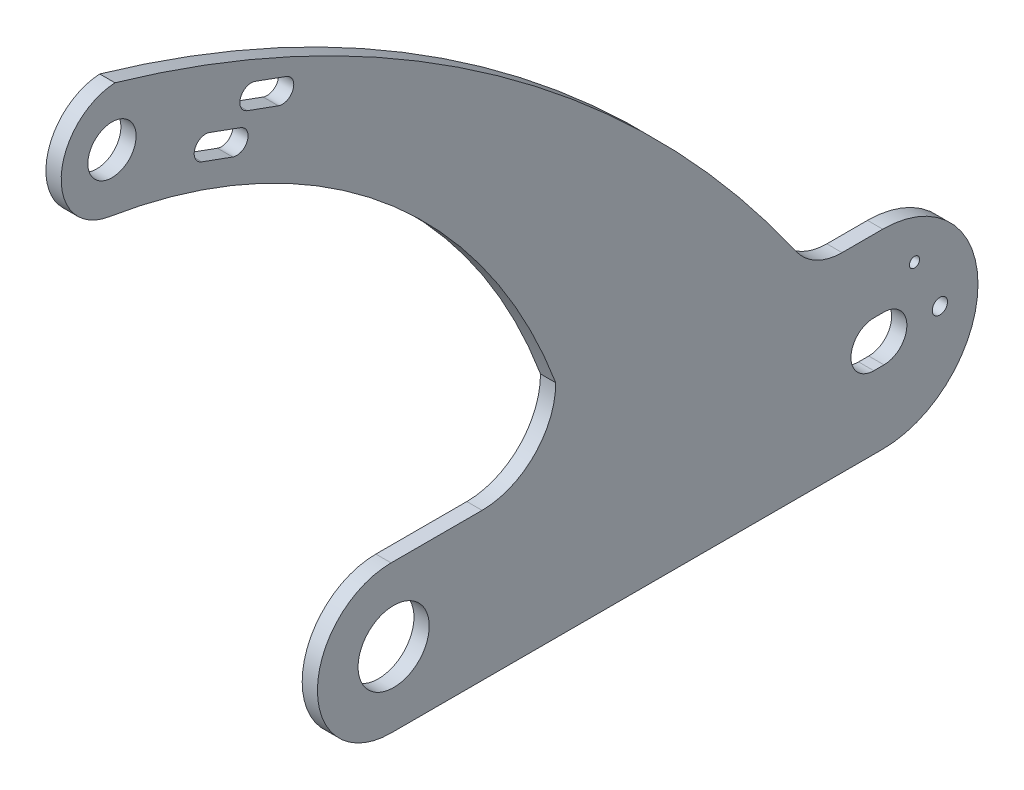
ISO-10303-21;
HEADER;
FILE_DESCRIPTION(('STEP AP214'),'2;1');
FILE_NAME('part.step','',(''),(''),'','','');
FILE_SCHEMA(('AUTOMOTIVE_DESIGN { 1 0 10303 214 1 1 1 1 }'));
ENDSEC;
DATA;
#1=APPLICATION_CONTEXT('core data for automotive mechanical design processes');
#2=APPLICATION_PROTOCOL_DEFINITION('international standard','automotive_design',2000,#1);
#3=PRODUCT_CONTEXT('',#1,'mechanical');
#4=PRODUCT('Part','Part','',(#3));
#5=PRODUCT_RELATED_PRODUCT_CATEGORY('part','',(#4));
#6=PRODUCT_DEFINITION_FORMATION('','',#4);
#7=PRODUCT_DEFINITION_CONTEXT('part definition',#1,'design');
#8=PRODUCT_DEFINITION('design','',#6,#7);
#9=PRODUCT_DEFINITION_SHAPE('','',#8);
#10=(LENGTH_UNIT() NAMED_UNIT(*) SI_UNIT(.MILLI.,.METRE.));
#11=(NAMED_UNIT(*) PLANE_ANGLE_UNIT() SI_UNIT($,.RADIAN.));
#12=(NAMED_UNIT(*) SI_UNIT($,.STERADIAN.) SOLID_ANGLE_UNIT());
#13=UNCERTAINTY_MEASURE_WITH_UNIT(LENGTH_MEASURE(1.E-05),#10,'distance_accuracy_value','');
#14=(GEOMETRIC_REPRESENTATION_CONTEXT(3) GLOBAL_UNCERTAINTY_ASSIGNED_CONTEXT((#13)) GLOBAL_UNIT_ASSIGNED_CONTEXT((#10,
#11,#12)) REPRESENTATION_CONTEXT('',''));
#15=CARTESIAN_POINT('',(0.,0.,0.));
#16=DIRECTION('',(0.,0.,1.));
#17=DIRECTION('',(1.,0.,0.));
#18=AXIS2_PLACEMENT_3D('',#15,#16,#17);
#19=CARTESIAN_POINT('',(3.,14.5,48.375));
#20=DIRECTION('',(-1.,0.,0.));
#21=DIRECTION('',(0.,0.,1.));
#22=AXIS2_PLACEMENT_3D('',#19,#20,#21);
#23=PLANE('',#22);
#24=CARTESIAN_POINT('',(3.,118.095735365004,84.8817253112062));
#25=DIRECTION('',(1.,0.,0.));
#26=DIRECTION('',(0.,0.,-1.));
#27=AXIS2_PLACEMENT_3D('',#24,#25,#26);
#28=CIRCLE('',#27,2.25000000000001);
#29=CARTESIAN_POINT('',(3.,120.210043761772,84.1121799887234));
#30=VERTEX_POINT('',#29);
#31=CARTESIAN_POINT('',(3.,115.981426968236,85.6512706336889));
#32=VERTEX_POINT('',#31);
#33=EDGE_CURVE('E241',#30,#32,#28,.T.);
#34=ORIENTED_EDGE('',*,*,#33,.F.);
#35=DIRECTION('',(0.,0.342020143325678,0.939692620785905));
#36=VECTOR('',#35,1.);
#37=CARTESIAN_POINT('',(3.,120.210043761772,84.1121799887234));
#38=LINE('',#37,#36);
#39=CARTESIAN_POINT('',(3.,117.986912830155,78.0041779536146));
#40=VERTEX_POINT('',#39);
#41=EDGE_CURVE('E252',#40,#30,#38,.T.);
#42=ORIENTED_EDGE('',*,*,#41,.F.);
#43=CARTESIAN_POINT('',(3.,115.872604433387,78.7737232760973));
#44=DIRECTION('',(1.,0.,0.));
#45=DIRECTION('',(0.,0.,-1.));
#46=AXIS2_PLACEMENT_3D('',#43,#44,#45);
#47=CIRCLE('',#46,2.24999999999998);
#48=CARTESIAN_POINT('',(3.,113.758296036619,79.5432685985799));
#49=VERTEX_POINT('',#48);
#50=EDGE_CURVE('E248',#49,#40,#47,.T.);
#51=ORIENTED_EDGE('',*,*,#50,.F.);
#52=DIRECTION('',(0.,-0.342020143325671,-0.939692620785908));
#53=VECTOR('',#52,1.);
#54=CARTESIAN_POINT('',(3.,115.981426968236,85.6512706336889));
#55=LINE('',#54,#53);
#56=EDGE_CURVE('E244',#32,#49,#55,.T.);
#57=ORIENTED_EDGE('',*,*,#56,.F.);
#58=EDGE_LOOP('',(#34,#42,#51,#57));
#59=FACE_BOUND('',#58,.T.);
#60=CARTESIAN_POINT('',(3.,18.75,-59.625));
#61=DIRECTION('',(1.,0.,0.));
#62=DIRECTION('',(0.,0.,-1.));
#63=AXIS2_PLACEMENT_3D('',#60,#61,#62);
#64=CIRCLE('',#63,1.5);
#65=CARTESIAN_POINT('',(3.,18.75,-61.125));
#66=VERTEX_POINT('',#65);
#67=EDGE_CURVE('E351',#66,#66,#64,.T.);
#68=ORIENTED_EDGE('',*,*,#67,.F.);
#69=EDGE_LOOP('',(#68));
#70=FACE_BOUND('',#69,.T.);
#71=CARTESIAN_POINT('',(3.,14.5,48.375));
#72=DIRECTION('',(1.,0.,0.));
#73=DIRECTION('',(0.,0.,1.));
#74=AXIS2_PLACEMENT_3D('',#71,#72,#73);
#75=CIRCLE('',#74,14.5);
#76=CARTESIAN_POINT('',(3.,29.,48.375));
#77=VERTEX_POINT('',#76);
#78=CARTESIAN_POINT('',(3.,0.,48.375));
#79=VERTEX_POINT('',#78);
#80=EDGE_CURVE('E359',#77,#79,#75,.T.);
#81=ORIENTED_EDGE('',*,*,#80,.T.);
#82=DIRECTION('',(0.,0.,-1.));
#83=VECTOR('',#82,1.);
#84=CARTESIAN_POINT('',(3.,0.,48.375));
#85=LINE('',#84,#83);
#86=CARTESIAN_POINT('',(3.,0.,-48.375));
#87=VERTEX_POINT('',#86);
#88=EDGE_CURVE('E363',#79,#87,#85,.T.);
#89=ORIENTED_EDGE('',*,*,#88,.T.);
#90=CARTESIAN_POINT('',(3.,18.75,-48.375));
#91=DIRECTION('',(1.,0.,0.));
#92=DIRECTION('',(0.,0.,1.));
#93=AXIS2_PLACEMENT_3D('',#90,#91,#92);
#94=CIRCLE('',#93,18.75);
#95=CARTESIAN_POINT('',(3.,37.5,-48.375));
#96=VERTEX_POINT('',#95);
#97=EDGE_CURVE('E367',#87,#96,#94,.T.);
#98=ORIENTED_EDGE('',*,*,#97,.T.);
#99=DIRECTION('',(0.,0.,1.));
#100=VECTOR('',#99,1.);
#101=CARTESIAN_POINT('',(3.,37.5,-48.375));
#102=LINE('',#101,#100);
#103=CARTESIAN_POINT('',(3.,37.5,-40.375));
#104=VERTEX_POINT('',#103);
#105=EDGE_CURVE('E370',#96,#104,#102,.T.);
#106=ORIENTED_EDGE('',*,*,#105,.T.);
#107=CARTESIAN_POINT('',(3.,48.5,-40.375));
#108=DIRECTION('',(-1.,0.,0.));
#109=DIRECTION('',(0.,0.,1.));
#110=AXIS2_PLACEMENT_3D('',#107,#108,#109);
#111=CIRCLE('',#110,11.);
#112=CARTESIAN_POINT('',(3.,42.1906592001385,-31.3643275128211));
#113=VERTEX_POINT('',#112);
#114=EDGE_CURVE('E373',#104,#113,#111,.T.);
#115=ORIENTED_EDGE('',*,*,#114,.T.);
#116=CARTESIAN_POINT('',(3.,-99.7246797185502,171.311780890037));
#117=DIRECTION('',(1.,0.,0.));
#118=DIRECTION('',(0.,0.,-1.));
#119=AXIS2_PLACEMENT_3D('',#116,#117,#118);
#120=CIRCLE('',#119,247.42184288727);
#121=CARTESIAN_POINT('',(3.,138.,102.722095146145));
#122=VERTEX_POINT('',#121);
#123=EDGE_CURVE('E376',#113,#122,#120,.T.);
#124=ORIENTED_EDGE('',*,*,#123,.T.);
#125=CARTESIAN_POINT('',(3.,126.801633622701,102.0911827153));
#126=DIRECTION('',(1.,0.,0.));
#127=DIRECTION('',(0.,0.,-1.));
#128=AXIS2_PLACEMENT_3D('',#125,#126,#127);
#129=CIRCLE('',#128,11.216125);
#130=CARTESIAN_POINT('',(3.,115.730561374973,103.889186970363));
#131=VERTEX_POINT('',#130);
#132=EDGE_CURVE('E379',#122,#131,#129,.T.);
#133=ORIENTED_EDGE('',*,*,#132,.T.);
#134=CARTESIAN_POINT('',(3.,4.03485944329796,122.029195711299));
#135=DIRECTION('',(-1.,0.,0.));
#136=DIRECTION('',(0.,0.,1.));
#137=AXIS2_PLACEMENT_3D('',#134,#135,#136);
#138=CIRCLE('',#137,113.159134616393);
#139=CARTESIAN_POINT('',(3.,43.5,15.975));
#140=VERTEX_POINT('',#139);
#141=EDGE_CURVE('E382',#131,#140,#138,.T.);
#142=ORIENTED_EDGE('',*,*,#141,.T.);
#143=CARTESIAN_POINT('',(3.,43.5,30.475));
#144=DIRECTION('',(-1.,0.,0.));
#145=DIRECTION('',(0.,0.,1.));
#146=AXIS2_PLACEMENT_3D('',#143,#144,#145);
#147=CIRCLE('',#146,14.5);
#148=CARTESIAN_POINT('',(3.,29.,30.475));
#149=VERTEX_POINT('',#148);
#150=EDGE_CURVE('E385',#140,#149,#147,.T.);
#151=ORIENTED_EDGE('',*,*,#150,.T.);
#152=DIRECTION('',(0.,0.,1.));
#153=VECTOR('',#152,1.);
#154=CARTESIAN_POINT('',(3.,29.,48.375));
#155=LINE('',#154,#153);
#156=EDGE_CURVE('E388',#149,#77,#155,.T.);
#157=ORIENTED_EDGE('',*,*,#156,.T.);
#158=EDGE_LOOP('',(#81,#89,#98,#106,#115,#124,#133,#142,#151,#157));
#159=FACE_BOUND('',#158,.T.);
#160=CARTESIAN_POINT('',(3.,18.75,-46.625));
#161=DIRECTION('',(1.,0.,0.));
#162=DIRECTION('',(0.,0.,-1.));
#163=AXIS2_PLACEMENT_3D('',#160,#161,#162);
#164=CIRCLE('',#163,4.5);
#165=CARTESIAN_POINT('',(3.,23.25,-46.625));
#166=VERTEX_POINT('',#165);
#167=CARTESIAN_POINT('',(3.,14.25,-46.625));
#168=VERTEX_POINT('',#167);
#169=EDGE_CURVE('E308',#166,#168,#164,.T.);
#170=ORIENTED_EDGE('',*,*,#169,.F.);
#171=DIRECTION('',(0.,0.,1.));
#172=VECTOR('',#171,1.);
#173=CARTESIAN_POINT('',(3.,23.25,-46.625));
#174=LINE('',#173,#172);
#175=CARTESIAN_POINT('',(3.,23.25,-48.625));
#176=VERTEX_POINT('',#175);
#177=EDGE_CURVE('E319',#176,#166,#174,.T.);
#178=ORIENTED_EDGE('',*,*,#177,.F.);
#179=CARTESIAN_POINT('',(3.,18.75,-48.625));
#180=DIRECTION('',(1.,0.,0.));
#181=DIRECTION('',(0.,0.,-1.));
#182=AXIS2_PLACEMENT_3D('',#179,#180,#181);
#183=CIRCLE('',#182,4.5);
#184=CARTESIAN_POINT('',(3.,14.25,-48.625));
#185=VERTEX_POINT('',#184);
#186=EDGE_CURVE('E315',#185,#176,#183,.T.);
#187=ORIENTED_EDGE('',*,*,#186,.F.);
#188=DIRECTION('',(0.,0.,-1.));
#189=VECTOR('',#188,1.);
#190=CARTESIAN_POINT('',(3.,14.25,-46.625));
#191=LINE('',#190,#189);
#192=EDGE_CURVE('E311',#168,#185,#191,.T.);
#193=ORIENTED_EDGE('',*,*,#192,.F.);
#194=EDGE_LOOP('',(#170,#178,#187,#193));
#195=FACE_BOUND('',#194,.T.);
#196=CARTESIAN_POINT('',(3.,28.75,-54.625));
#197=DIRECTION('',(1.,0.,0.));
#198=DIRECTION('',(0.,0.,-1.));
#199=AXIS2_PLACEMENT_3D('',#196,#197,#198);
#200=CIRCLE('',#199,0.999999999999998);
#201=CARTESIAN_POINT('',(3.,28.75,-55.625));
#202=VERTEX_POINT('',#201);
#203=EDGE_CURVE('E300',#202,#202,#200,.T.);
#204=ORIENTED_EDGE('',*,*,#203,.F.);
#205=EDGE_LOOP('',(#204));
#206=FACE_BOUND('',#205,.T.);
#207=CARTESIAN_POINT('',(3.,14.5,47.875));
#208=DIRECTION('',(1.,0.,0.));
#209=DIRECTION('',(0.,0.,-1.));
#210=AXIS2_PLACEMENT_3D('',#207,#208,#209);
#211=CIRCLE('',#210,7.);
#212=CARTESIAN_POINT('',(3.,14.5,40.875));
#213=VERTEX_POINT('',#212);
#214=EDGE_CURVE('E292',#213,#213,#211,.T.);
#215=ORIENTED_EDGE('',*,*,#214,.F.);
#216=EDGE_LOOP('',(#215));
#217=FACE_BOUND('',#216,.T.);
#218=CARTESIAN_POINT('',(3.,126.865280687486,103.305641058254));
#219=DIRECTION('',(1.,0.,0.));
#220=DIRECTION('',(0.,0.,-1.));
#221=AXIS2_PLACEMENT_3D('',#218,#219,#220);
#222=CIRCLE('',#221,4.75000000000001);
#223=CARTESIAN_POINT('',(3.,126.865280687486,98.5556410582536));
#224=VERTEX_POINT('',#223);
#225=EDGE_CURVE('E284',#224,#224,#222,.T.);
#226=ORIENTED_EDGE('',*,*,#225,.F.);
#227=EDGE_LOOP('',(#226));
#228=FACE_BOUND('',#227,.T.);
#229=CARTESIAN_POINT('',(3.,122.32435215854,75.8898695568463));
#230=DIRECTION('',(1.,0.,0.));
#231=DIRECTION('',(0.,0.,-1.));
#232=AXIS2_PLACEMENT_3D('',#229,#230,#231);
#233=CIRCLE('',#232,2.24999999999995);
#234=CARTESIAN_POINT('',(3.,124.438660555309,75.1203242343635));
#235=VERTEX_POINT('',#234);
#236=CARTESIAN_POINT('',(3.,120.210043761772,76.6594148793291));
#237=VERTEX_POINT('',#236);
#238=EDGE_CURVE('E193',#235,#237,#233,.T.);
#239=ORIENTED_EDGE('',*,*,#238,.F.);
#240=DIRECTION('',(0.,0.34202014332567,0.939692620785908));
#241=VECTOR('',#240,1.);
#242=CARTESIAN_POINT('',(3.,124.438660555309,75.1203242343635));
#243=LINE('',#242,#241);
#244=CARTESIAN_POINT('',(3.,122.215529623692,69.0123221992552));
#245=VERTEX_POINT('',#244);
#246=EDGE_CURVE('E219',#245,#235,#243,.T.);
#247=ORIENTED_EDGE('',*,*,#246,.F.);
#248=CARTESIAN_POINT('',(3.,120.101221226923,69.7818675217379));
#249=DIRECTION('',(1.,0.,0.));
#250=DIRECTION('',(0.,0.,-1.));
#251=AXIS2_PLACEMENT_3D('',#248,#249,#250);
#252=CIRCLE('',#251,2.24999999999998);
#253=CARTESIAN_POINT('',(3.,117.986912830155,70.5514128442207));
#254=VERTEX_POINT('',#253);
#255=EDGE_CURVE('E215',#254,#245,#252,.T.);
#256=ORIENTED_EDGE('',*,*,#255,.F.);
#257=DIRECTION('',(0.,-0.342020143325676,-0.939692620785906));
#258=VECTOR('',#257,1.);
#259=CARTESIAN_POINT('',(3.,120.210043761772,76.6594148793291));
#260=LINE('',#259,#258);
#261=EDGE_CURVE('E202',#237,#254,#260,.T.);
#262=ORIENTED_EDGE('',*,*,#261,.F.);
#263=EDGE_LOOP('',(#239,#247,#256,#262));
#264=FACE_BOUND('',#263,.T.);
#265=ADVANCED_FACE('F43',(#59,#70,#159,#195,#206,#217,#228,#264),#23,.F.);
#266=CARTESIAN_POINT('',(0.,14.5,48.375));
#267=DIRECTION('',(-1.,0.,0.));
#268=DIRECTION('',(0.,0.,1.));
#269=AXIS2_PLACEMENT_3D('',#266,#267,#268);
#270=PLANE('',#269);
#271=CARTESIAN_POINT('',(0.,14.5,47.875));
#272=DIRECTION('',(1.,0.,0.));
#273=DIRECTION('',(0.,0.,-1.));
#274=AXIS2_PLACEMENT_3D('',#271,#272,#273);
#275=CIRCLE('',#274,7.);
#276=CARTESIAN_POINT('',(0.,14.5,40.875));
#277=VERTEX_POINT('',#276);
#278=EDGE_CURVE('E288',#277,#277,#275,.T.);
#279=ORIENTED_EDGE('',*,*,#278,.T.);
#280=EDGE_LOOP('',(#279));
#281=FACE_BOUND('',#280,.T.);
#282=DIRECTION('',(0.,0.,1.));
#283=VECTOR('',#282,1.);
#284=CARTESIAN_POINT('',(0.,23.25,-46.625));
#285=LINE('',#284,#283);
#286=CARTESIAN_POINT('',(0.,23.25,-48.625));
#287=VERTEX_POINT('',#286);
#288=CARTESIAN_POINT('',(0.,23.25,-46.625));
#289=VERTEX_POINT('',#288);
#290=EDGE_CURVE('E312',#287,#289,#285,.T.);
#291=ORIENTED_EDGE('',*,*,#290,.T.);
#292=CARTESIAN_POINT('',(0.,18.75,-46.625));
#293=DIRECTION('',(1.,0.,0.));
#294=DIRECTION('',(0.,0.,-1.));
#295=AXIS2_PLACEMENT_3D('',#292,#293,#294);
#296=CIRCLE('',#295,4.5);
#297=CARTESIAN_POINT('',(0.,14.25,-46.625));
#298=VERTEX_POINT('',#297);
#299=EDGE_CURVE('E304',#289,#298,#296,.T.);
#300=ORIENTED_EDGE('',*,*,#299,.T.);
#301=DIRECTION('',(0.,0.,-1.));
#302=VECTOR('',#301,1.);
#303=CARTESIAN_POINT('',(0.,14.25,-46.625));
#304=LINE('',#303,#302);
#305=CARTESIAN_POINT('',(0.,14.25,-48.625));
#306=VERTEX_POINT('',#305);
#307=EDGE_CURVE('E326',#298,#306,#304,.T.);
#308=ORIENTED_EDGE('',*,*,#307,.T.);
#309=CARTESIAN_POINT('',(0.,18.75,-48.625));
#310=DIRECTION('',(1.,0.,0.));
#311=DIRECTION('',(0.,0.,-1.));
#312=AXIS2_PLACEMENT_3D('',#309,#310,#311);
#313=CIRCLE('',#312,4.5);
#314=EDGE_CURVE('E330',#306,#287,#313,.T.);
#315=ORIENTED_EDGE('',*,*,#314,.T.);
#316=EDGE_LOOP('',(#291,#300,#308,#315));
#317=FACE_BOUND('',#316,.T.);
#318=CARTESIAN_POINT('',(0.,18.75,-59.625));
#319=DIRECTION('',(1.,0.,0.));
#320=DIRECTION('',(0.,0.,-1.));
#321=AXIS2_PLACEMENT_3D('',#318,#319,#320);
#322=CIRCLE('',#321,1.5);
#323=CARTESIAN_POINT('',(0.,18.75,-61.125));
#324=VERTEX_POINT('',#323);
#325=EDGE_CURVE('E350',#324,#324,#322,.T.);
#326=ORIENTED_EDGE('',*,*,#325,.T.);
#327=EDGE_LOOP('',(#326));
#328=FACE_BOUND('',#327,.T.);
#329=CARTESIAN_POINT('',(0.,14.5,48.375));
#330=DIRECTION('',(1.,0.,0.));
#331=DIRECTION('',(0.,0.,1.));
#332=AXIS2_PLACEMENT_3D('',#329,#330,#331);
#333=CIRCLE('',#332,14.5);
#334=CARTESIAN_POINT('',(0.,29.,48.375));
#335=VERTEX_POINT('',#334);
#336=CARTESIAN_POINT('',(0.,0.,48.375));
#337=VERTEX_POINT('',#336);
#338=EDGE_CURVE('E355',#335,#337,#333,.T.);
#339=ORIENTED_EDGE('',*,*,#338,.F.);
#340=DIRECTION('',(0.,0.,1.));
#341=VECTOR('',#340,1.);
#342=CARTESIAN_POINT('',(0.,29.,48.375));
#343=LINE('',#342,#341);
#344=CARTESIAN_POINT('',(0.,29.,30.475));
#345=VERTEX_POINT('',#344);
#346=EDGE_CURVE('E364',#345,#335,#343,.T.);
#347=ORIENTED_EDGE('',*,*,#346,.F.);
#348=CARTESIAN_POINT('',(0.,43.5,30.475));
#349=DIRECTION('',(-1.,0.,0.));
#350=DIRECTION('',(0.,0.,1.));
#351=AXIS2_PLACEMENT_3D('',#348,#349,#350);
#352=CIRCLE('',#351,14.5);
#353=CARTESIAN_POINT('',(0.,43.5,15.975));
#354=VERTEX_POINT('',#353);
#355=EDGE_CURVE('E416',#354,#345,#352,.T.);
#356=ORIENTED_EDGE('',*,*,#355,.F.);
#357=CARTESIAN_POINT('',(0.,4.03485944329796,122.029195711299));
#358=DIRECTION('',(-1.,0.,0.));
#359=DIRECTION('',(0.,0.,1.));
#360=AXIS2_PLACEMENT_3D('',#357,#358,#359);
#361=CIRCLE('',#360,113.159134616393);
#362=CARTESIAN_POINT('',(0.,115.730561374973,103.889186970363));
#363=VERTEX_POINT('',#362);
#364=EDGE_CURVE('E413',#363,#354,#361,.T.);
#365=ORIENTED_EDGE('',*,*,#364,.F.);
#366=CARTESIAN_POINT('',(0.,126.801633622701,102.0911827153));
#367=DIRECTION('',(1.,0.,0.));
#368=DIRECTION('',(0.,0.,-1.));
#369=AXIS2_PLACEMENT_3D('',#366,#367,#368);
#370=CIRCLE('',#369,11.216125);
#371=CARTESIAN_POINT('',(0.,138.,102.722095146145));
#372=VERTEX_POINT('',#371);
#373=EDGE_CURVE('E410',#372,#363,#370,.T.);
#374=ORIENTED_EDGE('',*,*,#373,.F.);
#375=CARTESIAN_POINT('',(0.,-99.7246797185502,171.311780890037));
#376=DIRECTION('',(1.,0.,0.));
#377=DIRECTION('',(0.,0.,-1.));
#378=AXIS2_PLACEMENT_3D('',#375,#376,#377);
#379=CIRCLE('',#378,247.42184288727);
#380=CARTESIAN_POINT('',(0.,42.1906592001385,-31.3643275128211));
#381=VERTEX_POINT('',#380);
#382=EDGE_CURVE('E407',#381,#372,#379,.T.);
#383=ORIENTED_EDGE('',*,*,#382,.F.);
#384=CARTESIAN_POINT('',(0.,48.5,-40.375));
#385=DIRECTION('',(-1.,0.,0.));
#386=DIRECTION('',(0.,0.,1.));
#387=AXIS2_PLACEMENT_3D('',#384,#385,#386);
#388=CIRCLE('',#387,11.);
#389=CARTESIAN_POINT('',(0.,37.5,-40.375));
#390=VERTEX_POINT('',#389);
#391=EDGE_CURVE('E404',#390,#381,#388,.T.);
#392=ORIENTED_EDGE('',*,*,#391,.F.);
#393=DIRECTION('',(0.,0.,1.));
#394=VECTOR('',#393,1.);
#395=CARTESIAN_POINT('',(0.,37.5,-48.375));
#396=LINE('',#395,#394);
#397=CARTESIAN_POINT('',(0.,37.5,-48.375));
#398=VERTEX_POINT('',#397);
#399=EDGE_CURVE('E401',#398,#390,#396,.T.);
#400=ORIENTED_EDGE('',*,*,#399,.F.);
#401=CARTESIAN_POINT('',(0.,18.75,-48.375));
#402=DIRECTION('',(1.,0.,0.));
#403=DIRECTION('',(0.,0.,1.));
#404=AXIS2_PLACEMENT_3D('',#401,#402,#403);
#405=CIRCLE('',#404,18.75);
#406=CARTESIAN_POINT('',(0.,0.,-48.375));
#407=VERTEX_POINT('',#406);
#408=EDGE_CURVE('E398',#407,#398,#405,.T.);
#409=ORIENTED_EDGE('',*,*,#408,.F.);
#410=DIRECTION('',(0.,0.,-1.));
#411=VECTOR('',#410,1.);
#412=CARTESIAN_POINT('',(0.,0.,48.375));
#413=LINE('',#412,#411);
#414=EDGE_CURVE('E395',#337,#407,#413,.T.);
#415=ORIENTED_EDGE('',*,*,#414,.F.);
#416=EDGE_LOOP('',(#339,#347,#356,#365,#374,#383,#392,#400,#409,#415));
#417=FACE_BOUND('',#416,.T.);
#418=CARTESIAN_POINT('',(0.,28.75,-54.625));
#419=DIRECTION('',(1.,0.,0.));
#420=DIRECTION('',(0.,0.,-1.));
#421=AXIS2_PLACEMENT_3D('',#418,#419,#420);
#422=CIRCLE('',#421,0.999999999999998);
#423=CARTESIAN_POINT('',(0.,28.75,-55.625));
#424=VERTEX_POINT('',#423);
#425=EDGE_CURVE('E296',#424,#424,#422,.T.);
#426=ORIENTED_EDGE('',*,*,#425,.T.);
#427=EDGE_LOOP('',(#426));
#428=FACE_BOUND('',#427,.T.);
#429=CARTESIAN_POINT('',(0.,126.865280687486,103.305641058254));
#430=DIRECTION('',(1.,0.,0.));
#431=DIRECTION('',(0.,0.,-1.));
#432=AXIS2_PLACEMENT_3D('',#429,#430,#431);
#433=CIRCLE('',#432,4.75000000000001);
#434=CARTESIAN_POINT('',(0.,126.865280687486,98.5556410582536));
#435=VERTEX_POINT('',#434);
#436=EDGE_CURVE('E283',#435,#435,#433,.T.);
#437=ORIENTED_EDGE('',*,*,#436,.T.);
#438=EDGE_LOOP('',(#437));
#439=FACE_BOUND('',#438,.T.);
#440=DIRECTION('',(0.,0.342020143325678,0.939692620785905));
#441=VECTOR('',#440,1.);
#442=CARTESIAN_POINT('',(0.,120.210043761772,84.1121799887234));
#443=LINE('',#442,#441);
#444=CARTESIAN_POINT('',(0.,117.986912830155,78.0041779536146));
#445=VERTEX_POINT('',#444);
#446=CARTESIAN_POINT('',(0.,120.210043761772,84.1121799887234));
#447=VERTEX_POINT('',#446);
#448=EDGE_CURVE('E245',#445,#447,#443,.T.);
#449=ORIENTED_EDGE('',*,*,#448,.T.);
#450=CARTESIAN_POINT('',(0.,118.095735365004,84.8817253112062));
#451=DIRECTION('',(1.,0.,0.));
#452=DIRECTION('',(0.,0.,-1.));
#453=AXIS2_PLACEMENT_3D('',#450,#451,#452);
#454=CIRCLE('',#453,2.25000000000001);
#455=CARTESIAN_POINT('',(0.,115.981426968236,85.6512706336889));
#456=VERTEX_POINT('',#455);
#457=EDGE_CURVE('E211',#447,#456,#454,.T.);
#458=ORIENTED_EDGE('',*,*,#457,.T.);
#459=DIRECTION('',(0.,-0.342020143325671,-0.939692620785908));
#460=VECTOR('',#459,1.);
#461=CARTESIAN_POINT('',(0.,115.981426968236,85.6512706336889));
#462=LINE('',#461,#460);
#463=CARTESIAN_POINT('',(0.,113.758296036619,79.5432685985799));
#464=VERTEX_POINT('',#463);
#465=EDGE_CURVE('E259',#456,#464,#462,.T.);
#466=ORIENTED_EDGE('',*,*,#465,.T.);
#467=CARTESIAN_POINT('',(0.,115.872604433387,78.7737232760973));
#468=DIRECTION('',(1.,0.,0.));
#469=DIRECTION('',(0.,0.,-1.));
#470=AXIS2_PLACEMENT_3D('',#467,#468,#469);
#471=CIRCLE('',#470,2.24999999999998);
#472=EDGE_CURVE('E263',#464,#445,#471,.T.);
#473=ORIENTED_EDGE('',*,*,#472,.T.);
#474=EDGE_LOOP('',(#449,#458,#466,#473));
#475=FACE_BOUND('',#474,.T.);
#476=DIRECTION('',(0.,0.34202014332567,0.939692620785908));
#477=VECTOR('',#476,1.);
#478=CARTESIAN_POINT('',(0.,124.438660555309,75.1203242343635));
#479=LINE('',#478,#477);
#480=CARTESIAN_POINT('',(0.,122.215529623692,69.0123221992552));
#481=VERTEX_POINT('',#480);
#482=CARTESIAN_POINT('',(0.,124.438660555309,75.1203242343635));
#483=VERTEX_POINT('',#482);
#484=EDGE_CURVE('E203',#481,#483,#479,.T.);
#485=ORIENTED_EDGE('',*,*,#484,.T.);
#486=CARTESIAN_POINT('',(0.,122.32435215854,75.8898695568463));
#487=DIRECTION('',(1.,0.,0.));
#488=DIRECTION('',(0.,0.,-1.));
#489=AXIS2_PLACEMENT_3D('',#486,#487,#488);
#490=CIRCLE('',#489,2.24999999999995);
#491=CARTESIAN_POINT('',(0.,120.210043761772,76.6594148793291));
#492=VERTEX_POINT('',#491);
#493=EDGE_CURVE('E67',#483,#492,#490,.T.);
#494=ORIENTED_EDGE('',*,*,#493,.T.);
#495=DIRECTION('',(0.,-0.342020143325676,-0.939692620785906));
#496=VECTOR('',#495,1.);
#497=CARTESIAN_POINT('',(0.,120.210043761772,76.6594148793291));
#498=LINE('',#497,#496);
#499=CARTESIAN_POINT('',(0.,117.986912830155,70.5514128442207));
#500=VERTEX_POINT('',#499);
#501=EDGE_CURVE('E209',#492,#500,#498,.T.);
#502=ORIENTED_EDGE('',*,*,#501,.T.);
#503=CARTESIAN_POINT('',(0.,120.101221226923,69.7818675217379));
#504=DIRECTION('',(1.,0.,0.));
#505=DIRECTION('',(0.,0.,-1.));
#506=AXIS2_PLACEMENT_3D('',#503,#504,#505);
#507=CIRCLE('',#506,2.24999999999998);
#508=EDGE_CURVE('E228',#500,#481,#507,.T.);
#509=ORIENTED_EDGE('',*,*,#508,.T.);
#510=EDGE_LOOP('',(#485,#494,#502,#509));
#511=FACE_BOUND('',#510,.T.);
#512=ADVANCED_FACE('F463',(#281,#317,#328,#417,#428,#439,#475,#511),#270,.T.);
#513=CARTESIAN_POINT('',(3.,14.5,48.375));
#514=DIRECTION('',(-1.,0.,0.));
#515=DIRECTION('',(0.,0.,1.));
#516=AXIS2_PLACEMENT_3D('',#513,#514,#515);
#517=CYLINDRICAL_SURFACE('',#516,14.5);
#518=ORIENTED_EDGE('',*,*,#338,.T.);
#519=DIRECTION('',(-1.,0.,0.));
#520=VECTOR('',#519,1.);
#521=CARTESIAN_POINT('',(3.,0.,48.375));
#522=LINE('',#521,#520);
#523=EDGE_CURVE('E11',#79,#337,#522,.T.);
#524=ORIENTED_EDGE('',*,*,#523,.F.);
#525=ORIENTED_EDGE('',*,*,#80,.F.);
#526=DIRECTION('',(-1.,0.,0.));
#527=VECTOR('',#526,1.);
#528=CARTESIAN_POINT('',(3.,29.,48.375));
#529=LINE('',#528,#527);
#530=EDGE_CURVE('E391',#77,#335,#529,.T.);
#531=ORIENTED_EDGE('',*,*,#530,.T.);
#532=EDGE_LOOP('',(#518,#524,#525,#531));
#533=FACE_BOUND('',#532,.T.);
#534=ADVANCED_FACE('F45',(#533),#517,.T.);
#535=CARTESIAN_POINT('',(3.,0.,48.375));
#536=DIRECTION('',(0.,1.,0.));
#537=DIRECTION('',(0.,0.,1.));
#538=AXIS2_PLACEMENT_3D('',#535,#536,#537);
#539=PLANE('',#538);
#540=ORIENTED_EDGE('',*,*,#414,.T.);
#541=DIRECTION('',(-1.,0.,0.));
#542=VECTOR('',#541,1.);
#543=CARTESIAN_POINT('',(3.,0.,-48.375));
#544=LINE('',#543,#542);
#545=EDGE_CURVE('E52',#87,#407,#544,.T.);
#546=ORIENTED_EDGE('',*,*,#545,.F.);
#547=ORIENTED_EDGE('',*,*,#88,.F.);
#548=ORIENTED_EDGE('',*,*,#523,.T.);
#549=EDGE_LOOP('',(#540,#546,#547,#548));
#550=FACE_BOUND('',#549,.T.);
#551=ADVANCED_FACE('F481',(#550),#539,.F.);
#552=CARTESIAN_POINT('',(3.,18.75,-48.375));
#553=DIRECTION('',(-1.,0.,0.));
#554=DIRECTION('',(0.,0.,1.));
#555=AXIS2_PLACEMENT_3D('',#552,#553,#554);
#556=CYLINDRICAL_SURFACE('',#555,18.75);
#557=ORIENTED_EDGE('',*,*,#408,.T.);
#558=DIRECTION('',(-1.,0.,0.));
#559=VECTOR('',#558,1.);
#560=CARTESIAN_POINT('',(3.,37.5,-48.375));
#561=LINE('',#560,#559);
#562=EDGE_CURVE('E448',#96,#398,#561,.T.);
#563=ORIENTED_EDGE('',*,*,#562,.F.);
#564=ORIENTED_EDGE('',*,*,#97,.F.);
#565=ORIENTED_EDGE('',*,*,#545,.T.);
#566=EDGE_LOOP('',(#557,#563,#564,#565));
#567=FACE_BOUND('',#566,.T.);
#568=ADVANCED_FACE('F457',(#567),#556,.T.);
#569=CARTESIAN_POINT('',(3.,37.5,-48.375));
#570=DIRECTION('',(0.,-1.,0.));
#571=DIRECTION('',(0.,0.,-1.));
#572=AXIS2_PLACEMENT_3D('',#569,#570,#571);
#573=PLANE('',#572);
#574=ORIENTED_EDGE('',*,*,#399,.T.);
#575=DIRECTION('',(-1.,0.,0.));
#576=VECTOR('',#575,1.);
#577=CARTESIAN_POINT('',(3.,37.5,-40.375));
#578=LINE('',#577,#576);
#579=EDGE_CURVE('E444',#104,#390,#578,.T.);
#580=ORIENTED_EDGE('',*,*,#579,.F.);
#581=ORIENTED_EDGE('',*,*,#105,.F.);
#582=ORIENTED_EDGE('',*,*,#562,.T.);
#583=EDGE_LOOP('',(#574,#580,#581,#582));
#584=FACE_BOUND('',#583,.T.);
#585=ADVANCED_FACE('F469',(#584),#573,.F.);
#586=CARTESIAN_POINT('',(3.,48.5,-40.375));
#587=DIRECTION('',(-1.,0.,0.));
#588=DIRECTION('',(0.,0.,1.));
#589=AXIS2_PLACEMENT_3D('',#586,#587,#588);
#590=CYLINDRICAL_SURFACE('',#589,11.);
#591=ORIENTED_EDGE('',*,*,#391,.T.);
#592=DIRECTION('',(-1.,0.,0.));
#593=VECTOR('',#592,1.);
#594=CARTESIAN_POINT('',(3.,42.1906592001385,-31.3643275128211));
#595=LINE('',#594,#593);
#596=EDGE_CURVE('E440',#113,#381,#595,.T.);
#597=ORIENTED_EDGE('',*,*,#596,.F.);
#598=ORIENTED_EDGE('',*,*,#114,.F.);
#599=ORIENTED_EDGE('',*,*,#579,.T.);
#600=EDGE_LOOP('',(#591,#597,#598,#599));
#601=FACE_BOUND('',#600,.T.);
#602=ADVANCED_FACE('F473',(#601),#590,.F.);
#603=CARTESIAN_POINT('',(3.,-99.7246797185502,171.311780890037));
#604=DIRECTION('',(-1.,0.,0.));
#605=DIRECTION('',(0.,0.,1.));
#606=AXIS2_PLACEMENT_3D('',#603,#604,#605);
#607=CYLINDRICAL_SURFACE('',#606,247.42184288727);
#608=ORIENTED_EDGE('',*,*,#382,.T.);
#609=DIRECTION('',(-1.,0.,0.));
#610=VECTOR('',#609,1.);
#611=CARTESIAN_POINT('',(3.,138.,102.722095146145));
#612=LINE('',#611,#610);
#613=EDGE_CURVE('E436',#122,#372,#612,.T.);
#614=ORIENTED_EDGE('',*,*,#613,.F.);
#615=ORIENTED_EDGE('',*,*,#123,.F.);
#616=ORIENTED_EDGE('',*,*,#596,.T.);
#617=EDGE_LOOP('',(#608,#614,#615,#616));
#618=FACE_BOUND('',#617,.T.);
#619=ADVANCED_FACE('F504',(#618),#607,.T.);
#620=CARTESIAN_POINT('',(3.,126.801633622701,102.0911827153));
#621=DIRECTION('',(-1.,0.,0.));
#622=DIRECTION('',(0.,0.,1.));
#623=AXIS2_PLACEMENT_3D('',#620,#621,#622);
#624=CYLINDRICAL_SURFACE('',#623,11.216125);
#625=ORIENTED_EDGE('',*,*,#373,.T.);
#626=DIRECTION('',(-1.,0.,0.));
#627=VECTOR('',#626,1.);
#628=CARTESIAN_POINT('',(3.,115.730561374973,103.889186970363));
#629=LINE('',#628,#627);
#630=EDGE_CURVE('E432',#131,#363,#629,.T.);
#631=ORIENTED_EDGE('',*,*,#630,.F.);
#632=ORIENTED_EDGE('',*,*,#132,.F.);
#633=ORIENTED_EDGE('',*,*,#613,.T.);
#634=EDGE_LOOP('',(#625,#631,#632,#633));
#635=FACE_BOUND('',#634,.T.);
#636=ADVANCED_FACE('F501',(#635),#624,.T.);
#637=CARTESIAN_POINT('',(3.,4.03485944329796,122.029195711299));
#638=DIRECTION('',(-1.,0.,0.));
#639=DIRECTION('',(0.,0.,1.));
#640=AXIS2_PLACEMENT_3D('',#637,#638,#639);
#641=CYLINDRICAL_SURFACE('',#640,113.159134616393);
#642=ORIENTED_EDGE('',*,*,#364,.T.);
#643=DIRECTION('',(-1.,0.,0.));
#644=VECTOR('',#643,1.);
#645=CARTESIAN_POINT('',(3.,43.5,15.975));
#646=LINE('',#645,#644);
#647=EDGE_CURVE('E428',#140,#354,#646,.T.);
#648=ORIENTED_EDGE('',*,*,#647,.F.);
#649=ORIENTED_EDGE('',*,*,#141,.F.);
#650=ORIENTED_EDGE('',*,*,#630,.T.);
#651=EDGE_LOOP('',(#642,#648,#649,#650));
#652=FACE_BOUND('',#651,.T.);
#653=ADVANCED_FACE('F497',(#652),#641,.F.);
#654=CARTESIAN_POINT('',(3.,43.5,30.475));
#655=DIRECTION('',(-1.,0.,0.));
#656=DIRECTION('',(0.,0.,1.));
#657=AXIS2_PLACEMENT_3D('',#654,#655,#656);
#658=CYLINDRICAL_SURFACE('',#657,14.5);
#659=ORIENTED_EDGE('',*,*,#355,.T.);
#660=DIRECTION('',(-1.,0.,0.));
#661=VECTOR('',#660,1.);
#662=CARTESIAN_POINT('',(3.,29.,30.475));
#663=LINE('',#662,#661);
#664=EDGE_CURVE('E424',#149,#345,#663,.T.);
#665=ORIENTED_EDGE('',*,*,#664,.F.);
#666=ORIENTED_EDGE('',*,*,#150,.F.);
#667=ORIENTED_EDGE('',*,*,#647,.T.);
#668=EDGE_LOOP('',(#659,#665,#666,#667));
#669=FACE_BOUND('',#668,.T.);
#670=ADVANCED_FACE('F493',(#669),#658,.F.);
#671=CARTESIAN_POINT('',(3.,29.,48.375));
#672=DIRECTION('',(0.,-1.,0.));
#673=DIRECTION('',(0.,0.,-1.));
#674=AXIS2_PLACEMENT_3D('',#671,#672,#673);
#675=PLANE('',#674);
#676=ORIENTED_EDGE('',*,*,#346,.T.);
#677=ORIENTED_EDGE('',*,*,#530,.F.);
#678=ORIENTED_EDGE('',*,*,#156,.F.);
#679=ORIENTED_EDGE('',*,*,#664,.T.);
#680=EDGE_LOOP('',(#676,#677,#678,#679));
#681=FACE_BOUND('',#680,.T.);
#682=ADVANCED_FACE('F488',(#681),#675,.F.);
#683=CARTESIAN_POINT('',(3.,18.75,-59.625));
#684=DIRECTION('',(-1.,0.,0.));
#685=DIRECTION('',(0.,0.,1.));
#686=AXIS2_PLACEMENT_3D('',#683,#684,#685);
#687=CYLINDRICAL_SURFACE('',#686,1.5);
#688=ORIENTED_EDGE('',*,*,#67,.T.);
#689=EDGE_LOOP('',(#688));
#690=FACE_BOUND('',#689,.T.);
#691=ORIENTED_EDGE('',*,*,#325,.F.);
#692=EDGE_LOOP('',(#691));
#693=FACE_BOUND('',#692,.T.);
#694=ADVANCED_FACE('F524',(#690,#693),#687,.F.);
#695=CARTESIAN_POINT('',(3.,18.75,-46.625));
#696=DIRECTION('',(-1.,0.,0.));
#697=DIRECTION('',(0.,0.,1.));
#698=AXIS2_PLACEMENT_3D('',#695,#696,#697);
#699=CYLINDRICAL_SURFACE('',#698,4.5);
#700=ORIENTED_EDGE('',*,*,#299,.F.);
#701=DIRECTION('',(-1.,0.,0.));
#702=VECTOR('',#701,1.);
#703=CARTESIAN_POINT('',(3.,23.25,-46.625));
#704=LINE('',#703,#702);
#705=EDGE_CURVE('E322',#166,#289,#704,.T.);
#706=ORIENTED_EDGE('',*,*,#705,.F.);
#707=ORIENTED_EDGE('',*,*,#169,.T.);
#708=DIRECTION('',(-1.,0.,0.));
#709=VECTOR('',#708,1.);
#710=CARTESIAN_POINT('',(3.,14.25,-46.625));
#711=LINE('',#710,#709);
#712=EDGE_CURVE('E346',#168,#298,#711,.T.);
#713=ORIENTED_EDGE('',*,*,#712,.T.);
#714=EDGE_LOOP('',(#700,#706,#707,#713));
#715=FACE_BOUND('',#714,.T.);
#716=ADVANCED_FACE('F550',(#715),#699,.F.);
#717=CARTESIAN_POINT('',(3.,14.25,-46.625));
#718=DIRECTION('',(0.,1.,0.));
#719=DIRECTION('',(0.,0.,1.));
#720=AXIS2_PLACEMENT_3D('',#717,#718,#719);
#721=PLANE('',#720);
#722=ORIENTED_EDGE('',*,*,#307,.F.);
#723=ORIENTED_EDGE('',*,*,#712,.F.);
#724=ORIENTED_EDGE('',*,*,#192,.T.);
#725=DIRECTION('',(-1.,0.,0.));
#726=VECTOR('',#725,1.);
#727=CARTESIAN_POINT('',(3.,14.25,-48.625));
#728=LINE('',#727,#726);
#729=EDGE_CURVE('E343',#185,#306,#728,.T.);
#730=ORIENTED_EDGE('',*,*,#729,.T.);
#731=EDGE_LOOP('',(#722,#723,#724,#730));
#732=FACE_BOUND('',#731,.T.);
#733=ADVANCED_FACE('F557',(#732),#721,.T.);
#734=CARTESIAN_POINT('',(3.,18.75,-48.625));
#735=DIRECTION('',(-1.,0.,0.));
#736=DIRECTION('',(0.,0.,1.));
#737=AXIS2_PLACEMENT_3D('',#734,#735,#736);
#738=CYLINDRICAL_SURFACE('',#737,4.5);
#739=ORIENTED_EDGE('',*,*,#314,.F.);
#740=ORIENTED_EDGE('',*,*,#729,.F.);
#741=ORIENTED_EDGE('',*,*,#186,.T.);
#742=DIRECTION('',(-1.,0.,0.));
#743=VECTOR('',#742,1.);
#744=CARTESIAN_POINT('',(3.,23.25,-48.625));
#745=LINE('',#744,#743);
#746=EDGE_CURVE('E340',#176,#287,#745,.T.);
#747=ORIENTED_EDGE('',*,*,#746,.T.);
#748=EDGE_LOOP('',(#739,#740,#741,#747));
#749=FACE_BOUND('',#748,.T.);
#750=ADVANCED_FACE('F564',(#749),#738,.F.);
#751=CARTESIAN_POINT('',(3.,23.25,-46.625));
#752=DIRECTION('',(0.,-1.,0.));
#753=DIRECTION('',(0.,0.,-1.));
#754=AXIS2_PLACEMENT_3D('',#751,#752,#753);
#755=PLANE('',#754);
#756=ORIENTED_EDGE('',*,*,#290,.F.);
#757=ORIENTED_EDGE('',*,*,#746,.F.);
#758=ORIENTED_EDGE('',*,*,#177,.T.);
#759=ORIENTED_EDGE('',*,*,#705,.T.);
#760=EDGE_LOOP('',(#756,#757,#758,#759));
#761=FACE_BOUND('',#760,.T.);
#762=ADVANCED_FACE('F572',(#761),#755,.T.);
#763=CARTESIAN_POINT('',(3.,28.75,-54.625));
#764=DIRECTION('',(-1.,0.,0.));
#765=DIRECTION('',(0.,0.,1.));
#766=AXIS2_PLACEMENT_3D('',#763,#764,#765);
#767=CYLINDRICAL_SURFACE('',#766,0.999999999999998);
#768=ORIENTED_EDGE('',*,*,#203,.T.);
#769=EDGE_LOOP('',(#768));
#770=FACE_BOUND('',#769,.T.);
#771=ORIENTED_EDGE('',*,*,#425,.F.);
#772=EDGE_LOOP('',(#771));
#773=FACE_BOUND('',#772,.T.);
#774=ADVANCED_FACE('F580',(#770,#773),#767,.F.);
#775=CARTESIAN_POINT('',(3.,14.5,47.875));
#776=DIRECTION('',(-1.,0.,0.));
#777=DIRECTION('',(0.,0.,1.));
#778=AXIS2_PLACEMENT_3D('',#775,#776,#777);
#779=CYLINDRICAL_SURFACE('',#778,7.);
#780=ORIENTED_EDGE('',*,*,#214,.T.);
#781=EDGE_LOOP('',(#780));
#782=FACE_BOUND('',#781,.T.);
#783=ORIENTED_EDGE('',*,*,#278,.F.);
#784=EDGE_LOOP('',(#783));
#785=FACE_BOUND('',#784,.T.);
#786=ADVANCED_FACE('F588',(#782,#785),#779,.F.);
#787=CARTESIAN_POINT('',(3.,126.865280687486,103.305641058254));
#788=DIRECTION('',(-1.,0.,0.));
#789=DIRECTION('',(0.,0.,1.));
#790=AXIS2_PLACEMENT_3D('',#787,#788,#789);
#791=CYLINDRICAL_SURFACE('',#790,4.75000000000001);
#792=ORIENTED_EDGE('',*,*,#225,.T.);
#793=EDGE_LOOP('',(#792));
#794=FACE_BOUND('',#793,.T.);
#795=ORIENTED_EDGE('',*,*,#436,.F.);
#796=EDGE_LOOP('',(#795));
#797=FACE_BOUND('',#796,.T.);
#798=ADVANCED_FACE('F596',(#794,#797),#791,.F.);
#799=CARTESIAN_POINT('',(3.,118.095735365004,84.8817253112062));
#800=DIRECTION('',(-1.,0.,0.));
#801=DIRECTION('',(0.,0.,1.));
#802=AXIS2_PLACEMENT_3D('',#799,#800,#801);
#803=CYLINDRICAL_SURFACE('',#802,2.25000000000001);
#804=ORIENTED_EDGE('',*,*,#457,.F.);
#805=DIRECTION('',(-1.,0.,0.));
#806=VECTOR('',#805,1.);
#807=CARTESIAN_POINT('',(3.,120.210043761772,84.1121799887234));
#808=LINE('',#807,#806);
#809=EDGE_CURVE('E255',#30,#447,#808,.T.);
#810=ORIENTED_EDGE('',*,*,#809,.F.);
#811=ORIENTED_EDGE('',*,*,#33,.T.);
#812=DIRECTION('',(-1.,0.,0.));
#813=VECTOR('',#812,1.);
#814=CARTESIAN_POINT('',(3.,115.981426968236,85.6512706336889));
#815=LINE('',#814,#813);
#816=EDGE_CURVE('E279',#32,#456,#815,.T.);
#817=ORIENTED_EDGE('',*,*,#816,.T.);
#818=EDGE_LOOP('',(#804,#810,#811,#817));
#819=FACE_BOUND('',#818,.T.);
#820=ADVANCED_FACE('F604',(#819),#803,.F.);
#821=CARTESIAN_POINT('',(3.,115.981426968236,85.6512706336889));
#822=DIRECTION('',(0.,0.939692620785908,-0.342020143325671));
#823=DIRECTION('',(0.,0.342020143325671,0.939692620785908));
#824=AXIS2_PLACEMENT_3D('',#821,#822,#823);
#825=PLANE('',#824);
#826=ORIENTED_EDGE('',*,*,#465,.F.);
#827=ORIENTED_EDGE('',*,*,#816,.F.);
#828=ORIENTED_EDGE('',*,*,#56,.T.);
#829=DIRECTION('',(-1.,0.,0.));
#830=VECTOR('',#829,1.);
#831=CARTESIAN_POINT('',(3.,113.758296036619,79.5432685985799));
#832=LINE('',#831,#830);
#833=EDGE_CURVE('E276',#49,#464,#832,.T.);
#834=ORIENTED_EDGE('',*,*,#833,.T.);
#835=EDGE_LOOP('',(#826,#827,#828,#834));
#836=FACE_BOUND('',#835,.T.);
#837=ADVANCED_FACE('F612',(#836),#825,.T.);
#838=CARTESIAN_POINT('',(3.,115.872604433387,78.7737232760973));
#839=DIRECTION('',(-1.,0.,0.));
#840=DIRECTION('',(0.,0.,1.));
#841=AXIS2_PLACEMENT_3D('',#838,#839,#840);
#842=CYLINDRICAL_SURFACE('',#841,2.24999999999998);
#843=ORIENTED_EDGE('',*,*,#472,.F.);
#844=ORIENTED_EDGE('',*,*,#833,.F.);
#845=ORIENTED_EDGE('',*,*,#50,.T.);
#846=DIRECTION('',(-1.,0.,0.));
#847=VECTOR('',#846,1.);
#848=CARTESIAN_POINT('',(3.,117.986912830155,78.0041779536146));
#849=LINE('',#848,#847);
#850=EDGE_CURVE('E273',#40,#445,#849,.T.);
#851=ORIENTED_EDGE('',*,*,#850,.T.);
#852=EDGE_LOOP('',(#843,#844,#845,#851));
#853=FACE_BOUND('',#852,.T.);
#854=ADVANCED_FACE('F620',(#853),#842,.F.);
#855=CARTESIAN_POINT('',(3.,120.210043761772,84.1121799887234));
#856=DIRECTION('',(0.,-0.939692620785905,0.342020143325678));
#857=DIRECTION('',(0.,-0.342020143325678,-0.939692620785905));
#858=AXIS2_PLACEMENT_3D('',#855,#856,#857);
#859=PLANE('',#858);
#860=ORIENTED_EDGE('',*,*,#448,.F.);
#861=ORIENTED_EDGE('',*,*,#850,.F.);
#862=ORIENTED_EDGE('',*,*,#41,.T.);
#863=ORIENTED_EDGE('',*,*,#809,.T.);
#864=EDGE_LOOP('',(#860,#861,#862,#863));
#865=FACE_BOUND('',#864,.T.);
#866=ADVANCED_FACE('F628',(#865),#859,.T.);
#867=CARTESIAN_POINT('',(3.,122.32435215854,75.8898695568463));
#868=DIRECTION('',(-1.,0.,0.));
#869=DIRECTION('',(0.,0.,1.));
#870=AXIS2_PLACEMENT_3D('',#867,#868,#869);
#871=CYLINDRICAL_SURFACE('',#870,2.24999999999995);
#872=ORIENTED_EDGE('',*,*,#493,.F.);
#873=DIRECTION('',(-1.,0.,0.));
#874=VECTOR('',#873,1.);
#875=CARTESIAN_POINT('',(3.,124.438660555309,75.1203242343635));
#876=LINE('',#875,#874);
#877=EDGE_CURVE('E197',#235,#483,#876,.T.);
#878=ORIENTED_EDGE('',*,*,#877,.F.);
#879=ORIENTED_EDGE('',*,*,#238,.T.);
#880=DIRECTION('',(-1.,0.,0.));
#881=VECTOR('',#880,1.);
#882=CARTESIAN_POINT('',(3.,120.210043761772,76.6594148793291));
#883=LINE('',#882,#881);
#884=EDGE_CURVE('E196',#237,#492,#883,.T.);
#885=ORIENTED_EDGE('',*,*,#884,.T.);
#886=EDGE_LOOP('',(#872,#878,#879,#885));
#887=FACE_BOUND('',#886,.T.);
#888=ADVANCED_FACE('F195',(#887),#871,.F.);
#889=CARTESIAN_POINT('',(3.,120.210043761772,76.6594148793291));
#890=DIRECTION('',(0.,0.939692620785905,-0.342020143325676));
#891=DIRECTION('',(0.,0.342020143325676,0.939692620785906));
#892=AXIS2_PLACEMENT_3D('',#889,#890,#891);
#893=PLANE('',#892);
#894=ORIENTED_EDGE('',*,*,#501,.F.);
#895=ORIENTED_EDGE('',*,*,#884,.F.);
#896=ORIENTED_EDGE('',*,*,#261,.T.);
#897=DIRECTION('',(-1.,0.,0.));
#898=VECTOR('',#897,1.);
#899=CARTESIAN_POINT('',(3.,117.986912830155,70.5514128442207));
#900=LINE('',#899,#898);
#901=EDGE_CURVE('E212',#254,#500,#900,.T.);
#902=ORIENTED_EDGE('',*,*,#901,.T.);
#903=EDGE_LOOP('',(#894,#895,#896,#902));
#904=FACE_BOUND('',#903,.T.);
#905=ADVANCED_FACE('F206',(#904),#893,.T.);
#906=CARTESIAN_POINT('',(3.,120.101221226923,69.7818675217379));
#907=DIRECTION('',(-1.,0.,0.));
#908=DIRECTION('',(0.,0.,1.));
#909=AXIS2_PLACEMENT_3D('',#906,#907,#908);
#910=CYLINDRICAL_SURFACE('',#909,2.24999999999998);
#911=ORIENTED_EDGE('',*,*,#508,.F.);
#912=ORIENTED_EDGE('',*,*,#901,.F.);
#913=ORIENTED_EDGE('',*,*,#255,.T.);
#914=DIRECTION('',(-1.,0.,0.));
#915=VECTOR('',#914,1.);
#916=CARTESIAN_POINT('',(3.,122.215529623692,69.0123221992552));
#917=LINE('',#916,#915);
#918=EDGE_CURVE('E59',#245,#481,#917,.T.);
#919=ORIENTED_EDGE('',*,*,#918,.T.);
#920=EDGE_LOOP('',(#911,#912,#913,#919));
#921=FACE_BOUND('',#920,.T.);
#922=ADVANCED_FACE('F649',(#921),#910,.F.);
#923=CARTESIAN_POINT('',(3.,124.438660555309,75.1203242343635));
#924=DIRECTION('',(0.,-0.939692620785908,0.34202014332567));
#925=DIRECTION('',(0.,-0.34202014332567,-0.939692620785908));
#926=AXIS2_PLACEMENT_3D('',#923,#924,#925);
#927=PLANE('',#926);
#928=ORIENTED_EDGE('',*,*,#484,.F.);
#929=ORIENTED_EDGE('',*,*,#918,.F.);
#930=ORIENTED_EDGE('',*,*,#246,.T.);
#931=ORIENTED_EDGE('',*,*,#877,.T.);
#932=EDGE_LOOP('',(#928,#929,#930,#931));
#933=FACE_BOUND('',#932,.T.);
#934=ADVANCED_FACE('F656',(#933),#927,.T.);
#935=CLOSED_SHELL('',(#265,#512,#534,#551,#568,#585,#602,#619,#636,#653,#670,#682,#694,#716,
#733,#750,#762,#774,#786,#798,#820,#837,#854,#866,#888,#905,#922,#934));
#936=MANIFOLD_SOLID_BREP('B2',#935);
#937=ADVANCED_BREP_SHAPE_REPRESENTATION('',(#18,#936),#14);
#938=SHAPE_DEFINITION_REPRESENTATION(#9,#937);
ENDSEC;
END-ISO-10303-21;
